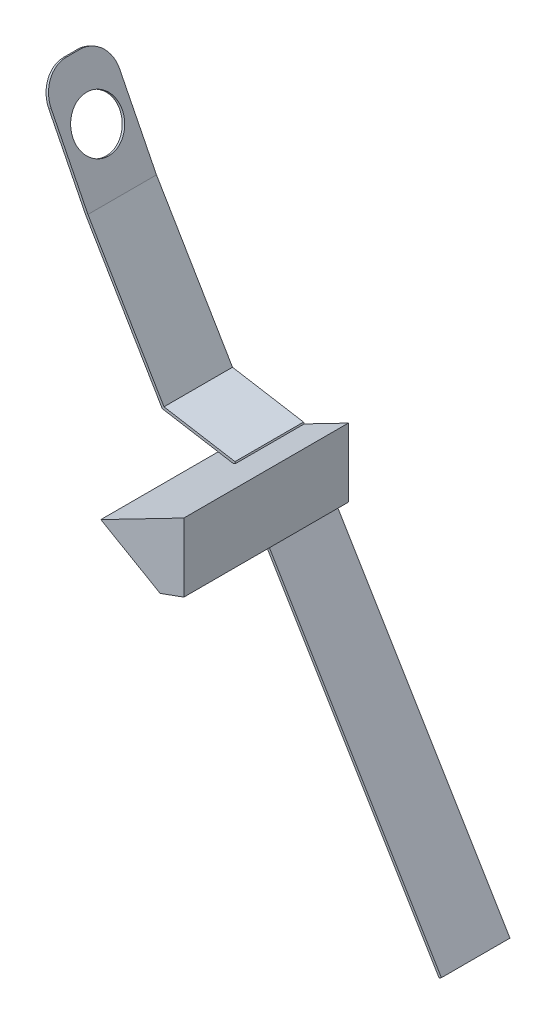
ISO-10303-21;
HEADER;
FILE_DESCRIPTION(('STEP AP214'),'2;1');
FILE_NAME('part.step','',(''),(''),'','','');
FILE_SCHEMA(('AUTOMOTIVE_DESIGN { 1 0 10303 214 1 1 1 1 }'));
ENDSEC;
DATA;
#1=APPLICATION_CONTEXT('core data for automotive mechanical design processes');
#2=APPLICATION_PROTOCOL_DEFINITION('international standard','automotive_design',2000,#1);
#3=PRODUCT_CONTEXT('',#1,'mechanical');
#4=PRODUCT('Part','Part','',(#3));
#5=PRODUCT_RELATED_PRODUCT_CATEGORY('part','',(#4));
#6=PRODUCT_DEFINITION_FORMATION('','',#4);
#7=PRODUCT_DEFINITION_CONTEXT('part definition',#1,'design');
#8=PRODUCT_DEFINITION('design','',#6,#7);
#9=PRODUCT_DEFINITION_SHAPE('','',#8);
#10=(LENGTH_UNIT() NAMED_UNIT(*) SI_UNIT(.MILLI.,.METRE.));
#11=(NAMED_UNIT(*) PLANE_ANGLE_UNIT() SI_UNIT($,.RADIAN.));
#12=(NAMED_UNIT(*) SI_UNIT($,.STERADIAN.) SOLID_ANGLE_UNIT());
#13=UNCERTAINTY_MEASURE_WITH_UNIT(LENGTH_MEASURE(1.E-05),#10,'distance_accuracy_value','');
#14=(GEOMETRIC_REPRESENTATION_CONTEXT(3) GLOBAL_UNCERTAINTY_ASSIGNED_CONTEXT((#13)) GLOBAL_UNIT_ASSIGNED_CONTEXT((#10,
#11,#12)) REPRESENTATION_CONTEXT('',''));
#15=CARTESIAN_POINT('',(0.,0.,0.));
#16=DIRECTION('',(0.,0.,1.));
#17=DIRECTION('',(1.,0.,0.));
#18=AXIS2_PLACEMENT_3D('',#15,#16,#17);
#19=CARTESIAN_POINT('',(40.9557511076707,157.673234146876,11.2182691909591));
#20=DIRECTION('',(-0.89375473782114,-0.448555981592339,0.));
#21=DIRECTION('',(0.448555981592339,-0.89375473782114,0.));
#22=AXIS2_PLACEMENT_3D('',#19,#20,#21);
#23=CYLINDRICAL_SURFACE('',#22,10.);
#24=DIRECTION('',(-0.89375473782114,-0.448555981592338,0.));
#25=VECTOR('',#24,1.);
#26=CARTESIAN_POINT('',(36.4701912917474,166.610781525088,11.218269190959));
#27=LINE('',#26,#25);
#28=CARTESIAN_POINT('',(-80.8799404831938,107.715313539515,11.218269190959));
#29=VERTEX_POINT('',#28);
#30=CARTESIAN_POINT('',(-81.7736952210149,107.266757557923,11.218269190959));
#31=VERTEX_POINT('',#30);
#32=EDGE_CURVE('E387',#29,#31,#27,.T.);
#33=ORIENTED_EDGE('',*,*,#32,.T.);
#34=CARTESIAN_POINT('',(-77.2881354050915,98.3292101797114,11.2182691909591));
#35=DIRECTION('',(-0.89375473782114,-0.448555981592338,0.));
#36=DIRECTION('',(0.448555981592338,-0.89375473782114,0.));
#37=AXIS2_PLACEMENT_3D('',#34,#35,#36);
#38=CIRCLE('',#37,10.);
#39=CARTESIAN_POINT('',(-77.2881354050915,98.3292101797114,21.2182691909591));
#40=VERTEX_POINT('',#39);
#41=EDGE_CURVE('E377',#40,#31,#38,.T.);
#42=ORIENTED_EDGE('',*,*,#41,.F.);
#43=DIRECTION('',(-0.89375473782114,-0.448555981592338,0.));
#44=VECTOR('',#43,1.);
#45=CARTESIAN_POINT('',(40.9557511076708,157.673234146876,21.2182691909591));
#46=LINE('',#45,#44);
#47=CARTESIAN_POINT('',(-76.3943806672704,98.7777661613037,21.2182691909591));
#48=VERTEX_POINT('',#47);
#49=EDGE_CURVE('E414',#48,#40,#46,.T.);
#50=ORIENTED_EDGE('',*,*,#49,.F.);
#51=CARTESIAN_POINT('',(-76.3943806672704,98.7777661613038,11.2182691909591));
#52=DIRECTION('',(0.89375473782114,0.448555981592338,0.));
#53=DIRECTION('',(0.448555981592338,-0.89375473782114,0.));
#54=AXIS2_PLACEMENT_3D('',#51,#52,#53);
#55=CIRCLE('',#54,10.);
#56=EDGE_CURVE('E361',#29,#48,#55,.T.);
#57=ORIENTED_EDGE('',*,*,#56,.F.);
#58=EDGE_LOOP('',(#33,#42,#50,#57));
#59=FACE_BOUND('',#58,.T.);
#60=ADVANCED_FACE('F14',(#59),#23,.T.);
#61=CARTESIAN_POINT('',(40.9557511076707,157.673234146876,6.21826919095909));
#62=DIRECTION('',(-0.89375473782114,-0.448555981592339,0.));
#63=DIRECTION('',(0.448555981592339,-0.89375473782114,0.));
#64=AXIS2_PLACEMENT_3D('',#61,#62,#63);
#65=CYLINDRICAL_SURFACE('',#64,10.);
#66=CARTESIAN_POINT('',(-76.3943806672704,98.7777661613038,6.21826919095909));
#67=DIRECTION('',(-0.89375473782114,-0.448555981592338,0.));
#68=DIRECTION('',(0.448555981592338,-0.89375473782114,0.));
#69=AXIS2_PLACEMENT_3D('',#66,#67,#68);
#70=CIRCLE('',#69,10.);
#71=CARTESIAN_POINT('',(-80.8799404831938,107.715313539515,6.21826919095909));
#72=VERTEX_POINT('',#71);
#73=CARTESIAN_POINT('',(-76.3943806672704,98.7777661613038,-3.78173080904092));
#74=VERTEX_POINT('',#73);
#75=EDGE_CURVE('E300',#72,#74,#70,.T.);
#76=ORIENTED_EDGE('',*,*,#75,.T.);
#77=DIRECTION('',(-0.89375473782114,-0.448555981592338,0.));
#78=VECTOR('',#77,1.);
#79=CARTESIAN_POINT('',(40.9557511076708,157.673234146876,-3.78173080904092));
#80=LINE('',#79,#78);
#81=CARTESIAN_POINT('',(-77.2881354050915,98.3292101797114,-3.78173080904092));
#82=VERTEX_POINT('',#81);
#83=EDGE_CURVE('E142',#74,#82,#80,.T.);
#84=ORIENTED_EDGE('',*,*,#83,.T.);
#85=CARTESIAN_POINT('',(-77.2881354050915,98.3292101797114,6.21826919095909));
#86=DIRECTION('',(0.89375473782114,0.448555981592338,0.));
#87=DIRECTION('',(0.448555981592338,-0.89375473782114,0.));
#88=AXIS2_PLACEMENT_3D('',#85,#86,#87);
#89=CIRCLE('',#88,10.);
#90=CARTESIAN_POINT('',(-81.7736952210149,107.266757557923,6.21826919095916));
#91=VERTEX_POINT('',#90);
#92=EDGE_CURVE('E388',#82,#91,#89,.T.);
#93=ORIENTED_EDGE('',*,*,#92,.T.);
#94=DIRECTION('',(-0.89375473782114,-0.448555981592338,0.));
#95=VECTOR('',#94,1.);
#96=CARTESIAN_POINT('',(36.4701912917474,166.610781525088,6.21826919095916));
#97=LINE('',#96,#95);
#98=EDGE_CURVE('E384',#72,#91,#97,.T.);
#99=ORIENTED_EDGE('',*,*,#98,.F.);
#100=EDGE_LOOP('',(#76,#84,#93,#99));
#101=FACE_BOUND('',#100,.T.);
#102=ADVANCED_FACE('F598',(#101),#65,.T.);
#103=CARTESIAN_POINT('',(45.4413109235942,148.735686768665,8.7182691909591));
#104=DIRECTION('',(-0.89375473782114,-0.448555981592338,0.));
#105=DIRECTION('',(0.448555981592338,-0.89375473782114,0.));
#106=AXIS2_PLACEMENT_3D('',#103,#104,#105);
#107=CYLINDRICAL_SURFACE('',#106,9.);
#108=DIRECTION('',(-0.89375473782114,-0.448555981592338,0.));
#109=VECTOR('',#108,1.);
#110=CARTESIAN_POINT('',(41.4043070892631,156.779479409056,8.7182691909591));
#111=LINE('',#110,#109);
#112=CARTESIAN_POINT('',(-75.945824685678,97.8840114234826,8.7182691909591));
#113=VERTEX_POINT('',#112);
#114=CARTESIAN_POINT('',(-76.8395794234992,97.4354554418902,8.7182691909591));
#115=VERTEX_POINT('',#114);
#116=EDGE_CURVE('E320',#113,#115,#111,.T.);
#117=ORIENTED_EDGE('',*,*,#116,.F.);
#118=CARTESIAN_POINT('',(-71.908820851347,89.8402187830923,8.7182691909591));
#119=DIRECTION('',(0.89375473782114,0.448555981592338,0.));
#120=DIRECTION('',(0.448555981592338,-0.89375473782114,0.));
#121=AXIS2_PLACEMENT_3D('',#118,#119,#120);
#122=CIRCLE('',#121,9.);
#123=CARTESIAN_POINT('',(-67.871817017016,81.7964261427021,8.71826919095909));
#124=VERTEX_POINT('',#123);
#125=EDGE_CURVE('E243',#113,#124,#122,.T.);
#126=ORIENTED_EDGE('',*,*,#125,.T.);
#127=DIRECTION('',(-0.89375473782114,-0.448555981592338,0.));
#128=VECTOR('',#127,1.);
#129=CARTESIAN_POINT('',(49.4783147579252,140.691894128275,8.7182691909591));
#130=LINE('',#129,#128);
#131=CARTESIAN_POINT('',(-68.7655717548371,81.3478701611097,8.71826919095909));
#132=VERTEX_POINT('',#131);
#133=EDGE_CURVE('E292',#124,#132,#130,.T.);
#134=ORIENTED_EDGE('',*,*,#133,.T.);
#135=CARTESIAN_POINT('',(-72.8025755891681,89.3916628015,8.7182691909591));
#136=DIRECTION('',(-0.89375473782114,-0.448555981592338,0.));
#137=DIRECTION('',(0.448555981592338,-0.89375473782114,0.));
#138=AXIS2_PLACEMENT_3D('',#135,#136,#137);
#139=CIRCLE('',#138,9.);
#140=EDGE_CURVE('E232',#132,#115,#139,.T.);
#141=ORIENTED_EDGE('',*,*,#140,.T.);
#142=EDGE_LOOP('',(#117,#126,#134,#141));
#143=FACE_BOUND('',#142,.T.);
#144=ADVANCED_FACE('F458',(#143),#107,.F.);
#145=CARTESIAN_POINT('',(34.4350596062457,-94.0127100872075,56.2182691909591));
#146=DIRECTION('',(0.,0.,-1.));
#147=DIRECTION('',(0.,-1.,0.));
#148=AXIS2_PLACEMENT_3D('',#145,#146,#147);
#149=PLANE('',#148);
#150=DIRECTION('',(-0.939910462979379,-0.341421032717507,0.));
#151=VECTOR('',#150,1.);
#152=CARTESIAN_POINT('',(7.04227570314696,3.56631866591899,56.2182691909591));
#153=LINE('',#152,#151);
#154=CARTESIAN_POINT('',(7.04227570314696,3.56631866591899,56.2182691909591));
#155=VERTEX_POINT('',#154);
#156=CARTESIAN_POINT('',(-1.60470092820694,0.425317679502938,56.2182691909591));
#157=VERTEX_POINT('',#156);
#158=EDGE_CURVE('E263',#155,#157,#153,.T.);
#159=ORIENTED_EDGE('',*,*,#158,.F.);
#160=DIRECTION('',(0.,-1.,0.));
#161=VECTOR('',#160,1.);
#162=CARTESIAN_POINT('',(7.04227570314696,3.56631866591899,56.2182691909591));
#163=LINE('',#162,#161);
#164=CARTESIAN_POINT('',(7.04227570314696,28.566318665919,56.2182691909591));
#165=VERTEX_POINT('',#164);
#166=EDGE_CURVE('E9',#165,#155,#163,.T.);
#167=ORIENTED_EDGE('',*,*,#166,.F.);
#168=DIRECTION('',(0.88857853117979,0.458724529457895,0.));
#169=VECTOR('',#168,1.);
#170=CARTESIAN_POINT('',(7.04227570314696,28.566318665919,56.2182691909591));
#171=LINE('',#170,#169);
#172=CARTESIAN_POINT('',(-23.2553360228179,12.9253176795029,56.2182691909591));
#173=VERTEX_POINT('',#172);
#174=EDGE_CURVE('E299',#173,#165,#171,.T.);
#175=ORIENTED_EDGE('',*,*,#174,.F.);
#176=DIRECTION('',(-0.866025403784439,0.5,0.));
#177=VECTOR('',#176,1.);
#178=CARTESIAN_POINT('',(-23.2553360228179,12.9253176795029,56.2182691909591));
#179=LINE('',#178,#177);
#180=EDGE_CURVE('E267',#157,#173,#179,.T.);
#181=ORIENTED_EDGE('',*,*,#180,.F.);
#182=EDGE_LOOP('',(#159,#167,#175,#181));
#183=FACE_BOUND('',#182,.T.);
#184=ADVANCED_FACE('F620',(#183),#149,.F.);
#185=CARTESIAN_POINT('',(7.04227570314697,3.56631866591899,-45.1321989178156));
#186=DIRECTION('',(-1.,0.,0.));
#187=DIRECTION('',(0.,0.,1.));
#188=AXIS2_PLACEMENT_3D('',#185,#186,#187);
#189=PLANE('',#188);
#190=DIRECTION('',(0.,-1.,0.));
#191=VECTOR('',#190,1.);
#192=CARTESIAN_POINT('',(7.04227570314697,3.56631866591899,-3.78173080904092));
#193=LINE('',#192,#191);
#194=CARTESIAN_POINT('',(7.04227570314697,28.566318665919,-3.78173080904092));
#195=VERTEX_POINT('',#194);
#196=CARTESIAN_POINT('',(7.04227570314697,3.56631866591899,-3.78173080904092));
#197=VERTEX_POINT('',#196);
#198=EDGE_CURVE('E362',#195,#197,#193,.T.);
#199=ORIENTED_EDGE('',*,*,#198,.F.);
#200=DIRECTION('',(0.,0.,1.));
#201=VECTOR('',#200,1.);
#202=CARTESIAN_POINT('',(7.04227570314697,28.566318665919,-45.1321989178156));
#203=LINE('',#202,#201);
#204=EDGE_CURVE('E25',#195,#165,#203,.T.);
#205=ORIENTED_EDGE('',*,*,#204,.T.);
#206=ORIENTED_EDGE('',*,*,#166,.T.);
#207=DIRECTION('',(0.,0.,1.));
#208=VECTOR('',#207,1.);
#209=CARTESIAN_POINT('',(7.04227570314697,3.56631866591899,-45.1321989178156));
#210=LINE('',#209,#208);
#211=EDGE_CURVE('E339',#197,#155,#210,.T.);
#212=ORIENTED_EDGE('',*,*,#211,.F.);
#213=EDGE_LOOP('',(#199,#205,#206,#212));
#214=FACE_BOUND('',#213,.T.);
#215=ADVANCED_FACE('F630',(#214),#189,.F.);
#216=CARTESIAN_POINT('',(7.04227570314697,28.566318665919,-45.1321989178156));
#217=DIRECTION('',(0.458724529457895,-0.88857853117979,0.));
#218=DIRECTION('',(0.,0.,-1.));
#219=AXIS2_PLACEMENT_3D('',#216,#217,#218);
#220=PLANE('',#219);
#221=DIRECTION('',(0.,0.,-1.));
#222=VECTOR('',#221,1.);
#223=CARTESIAN_POINT('',(-9.91871728987898,19.810285004455,21.2182691909591));
#224=LINE('',#223,#222);
#225=CARTESIAN_POINT('',(-9.91871728987898,19.810285004455,21.2182691909591));
#226=VERTEX_POINT('',#225);
#227=CARTESIAN_POINT('',(-9.91871728987898,19.810285004455,-3.78173080904092));
#228=VERTEX_POINT('',#227);
#229=EDGE_CURVE('E329',#226,#228,#224,.T.);
#230=ORIENTED_EDGE('',*,*,#229,.T.);
#231=DIRECTION('',(0.88857853117979,0.458724529457895,0.));
#232=VECTOR('',#231,1.);
#233=CARTESIAN_POINT('',(7.04227570314697,28.566318665919,-3.78173080904092));
#234=LINE('',#233,#232);
#235=CARTESIAN_POINT('',(-23.2553360228179,12.9253176795029,-3.78173080904092));
#236=VERTEX_POINT('',#235);
#237=EDGE_CURVE('E277',#236,#228,#234,.T.);
#238=ORIENTED_EDGE('',*,*,#237,.F.);
#239=DIRECTION('',(0.,0.,1.));
#240=VECTOR('',#239,1.);
#241=CARTESIAN_POINT('',(-23.2553360228179,12.9253176795029,-45.1321989178156));
#242=LINE('',#241,#240);
#243=EDGE_CURVE('E273',#236,#173,#242,.T.);
#244=ORIENTED_EDGE('',*,*,#243,.T.);
#245=ORIENTED_EDGE('',*,*,#174,.T.);
#246=ORIENTED_EDGE('',*,*,#204,.F.);
#247=DIRECTION('',(0.88857853117979,0.458724529457895,0.));
#248=VECTOR('',#247,1.);
#249=CARTESIAN_POINT('',(7.04227570314697,28.566318665919,-3.78173080904092));
#250=LINE('',#249,#248);
#251=CARTESIAN_POINT('',(-9.02830542147885,20.2699559857168,-3.78173080904092));
#252=VERTEX_POINT('',#251);
#253=EDGE_CURVE('E364',#252,#195,#250,.T.);
#254=ORIENTED_EDGE('',*,*,#253,.F.);
#255=DIRECTION('',(0.,0.,1.));
#256=VECTOR('',#255,1.);
#257=CARTESIAN_POINT('',(-9.02830542147884,20.2699559857168,21.2182691909591));
#258=LINE('',#257,#256);
#259=CARTESIAN_POINT('',(-9.02830542147886,20.2699559857168,21.2182691909591));
#260=VERTEX_POINT('',#259);
#261=EDGE_CURVE('E208',#252,#260,#258,.T.);
#262=ORIENTED_EDGE('',*,*,#261,.T.);
#263=DIRECTION('',(0.88857853117979,0.458724529457895,0.));
#264=VECTOR('',#263,1.);
#265=CARTESIAN_POINT('',(-31.4105545456091,8.7152240881952,21.2182691909591));
#266=LINE('',#265,#264);
#267=EDGE_CURVE('E383',#226,#260,#266,.T.);
#268=ORIENTED_EDGE('',*,*,#267,.F.);
#269=EDGE_LOOP('',(#230,#238,#244,#245,#246,#254,#262,#268));
#270=FACE_BOUND('',#269,.T.);
#271=ADVANCED_FACE('F640',(#270),#220,.F.);
#272=CARTESIAN_POINT('',(-23.2553360228179,12.9253176795029,-45.1321989178156));
#273=DIRECTION('',(0.5,0.866025403784439,0.));
#274=DIRECTION('',(0.,0.,-1.));
#275=AXIS2_PLACEMENT_3D('',#272,#273,#274);
#276=PLANE('',#275);
#277=DIRECTION('',(-0.866025403784439,0.5,0.));
#278=VECTOR('',#277,1.);
#279=CARTESIAN_POINT('',(-23.2553360228179,12.9253176795029,-3.78173080904092));
#280=LINE('',#279,#278);
#281=CARTESIAN_POINT('',(-1.60470092820693,0.425317679502938,-3.78173080904092));
#282=VERTEX_POINT('',#281);
#283=EDGE_CURVE('E270',#282,#236,#280,.T.);
#284=ORIENTED_EDGE('',*,*,#283,.F.);
#285=DIRECTION('',(0.,0.,1.));
#286=VECTOR('',#285,1.);
#287=CARTESIAN_POINT('',(-1.60470092820693,0.425317679502938,-45.1321989178156));
#288=LINE('',#287,#286);
#289=EDGE_CURVE('E256',#282,#157,#288,.T.);
#290=ORIENTED_EDGE('',*,*,#289,.T.);
#291=ORIENTED_EDGE('',*,*,#180,.T.);
#292=ORIENTED_EDGE('',*,*,#243,.F.);
#293=EDGE_LOOP('',(#284,#290,#291,#292));
#294=FACE_BOUND('',#293,.T.);
#295=ADVANCED_FACE('F271',(#294),#276,.F.);
#296=CARTESIAN_POINT('',(7.04227570314697,3.56631866591899,-45.1321989178156));
#297=DIRECTION('',(-0.341421032717507,0.93991046297938,0.));
#298=DIRECTION('',(0.,0.,1.));
#299=AXIS2_PLACEMENT_3D('',#296,#297,#298);
#300=PLANE('',#299);
#301=DIRECTION('',(0.,0.,-1.));
#302=VECTOR('',#301,1.);
#303=CARTESIAN_POINT('',(1.12531615134321,1.41699219250058,21.2182691909591));
#304=LINE('',#303,#302);
#305=CARTESIAN_POINT('',(1.12531615134321,1.41699219250058,21.2182691909591));
#306=VERTEX_POINT('',#305);
#307=CARTESIAN_POINT('',(1.12531615134321,1.41699219250058,-3.78173080904092));
#308=VERTEX_POINT('',#307);
#309=EDGE_CURVE('E181',#306,#308,#304,.T.);
#310=ORIENTED_EDGE('',*,*,#309,.F.);
#311=DIRECTION('',(-0.939910462979379,-0.341421032717507,0.));
#312=VECTOR('',#311,1.);
#313=CARTESIAN_POINT('',(-33.7642355829893,-11.256583912214,21.2182691909591));
#314=LINE('',#313,#312);
#315=CARTESIAN_POINT('',(2.08287954319903,1.7648256245315,21.2182691909591));
#316=VERTEX_POINT('',#315);
#317=EDGE_CURVE('E315',#316,#306,#314,.T.);
#318=ORIENTED_EDGE('',*,*,#317,.F.);
#319=DIRECTION('',(0.,0.,-1.));
#320=VECTOR('',#319,1.);
#321=CARTESIAN_POINT('',(2.08287954319905,1.76482562453148,21.2182691909591));
#322=LINE('',#321,#320);
#323=CARTESIAN_POINT('',(2.08287954319903,1.76482562453152,-3.78173080904092));
#324=VERTEX_POINT('',#323);
#325=EDGE_CURVE('E310',#316,#324,#322,.T.);
#326=ORIENTED_EDGE('',*,*,#325,.T.);
#327=DIRECTION('',(-0.939910462979379,-0.341421032717507,0.));
#328=VECTOR('',#327,1.);
#329=CARTESIAN_POINT('',(7.04227570314697,3.56631866591899,-3.78173080904092));
#330=LINE('',#329,#328);
#331=EDGE_CURVE('E96',#197,#324,#330,.T.);
#332=ORIENTED_EDGE('',*,*,#331,.F.);
#333=ORIENTED_EDGE('',*,*,#211,.T.);
#334=ORIENTED_EDGE('',*,*,#158,.T.);
#335=ORIENTED_EDGE('',*,*,#289,.F.);
#336=DIRECTION('',(-0.939910462979379,-0.341421032717507,0.));
#337=VECTOR('',#336,1.);
#338=CARTESIAN_POINT('',(7.04227570314697,3.56631866591899,-3.78173080904092));
#339=LINE('',#338,#337);
#340=EDGE_CURVE('E260',#308,#282,#339,.T.);
#341=ORIENTED_EDGE('',*,*,#340,.F.);
#342=EDGE_LOOP('',(#310,#318,#326,#332,#333,#334,#335,#341));
#343=FACE_BOUND('',#342,.T.);
#344=ADVANCED_FACE('F258',(#343),#300,.F.);
#345=CARTESIAN_POINT('',(-34.9741685060046,24.6842184807334,21.2182691909591));
#346=DIRECTION('',(-0.860750591998987,-0.509026932856596,0.));
#347=DIRECTION('',(-0.509026932856596,0.860750591998987,0.));
#348=AXIS2_PLACEMENT_3D('',#345,#346,#347);
#349=PLANE('',#348);
#350=DIRECTION('',(-0.509026932856596,0.860750591998987,0.));
#351=VECTOR('',#350,1.);
#352=CARTESIAN_POINT('',(-34.9741685060046,24.6842184807334,-3.78173080904092));
#353=LINE('',#352,#351);
#354=CARTESIAN_POINT('',(-35.2106707887185,25.0841373587243,-3.78173080904092));
#355=VERTEX_POINT('',#354);
#356=CARTESIAN_POINT('',(-62.9531611935689,71.9959282643511,-3.78173080904092));
#357=VERTEX_POINT('',#356);
#358=EDGE_CURVE('E155',#355,#357,#353,.T.);
#359=ORIENTED_EDGE('',*,*,#358,.T.);
#360=DIRECTION('',(0.,0.,-1.));
#361=VECTOR('',#360,1.);
#362=CARTESIAN_POINT('',(-62.9531611935688,71.9959282643511,21.2182691909591));
#363=LINE('',#362,#361);
#364=CARTESIAN_POINT('',(-62.9531611935689,71.9959282643511,21.2182691909591));
#365=VERTEX_POINT('',#364);
#366=EDGE_CURVE('E355',#365,#357,#363,.T.);
#367=ORIENTED_EDGE('',*,*,#366,.F.);
#368=DIRECTION('',(-0.509026932856596,0.860750591998987,0.));
#369=VECTOR('',#368,1.);
#370=CARTESIAN_POINT('',(-34.9741685060046,24.6842184807334,21.2182691909591));
#371=LINE('',#370,#369);
#372=CARTESIAN_POINT('',(-35.2106707887185,25.0841373587243,21.2182691909591));
#373=VERTEX_POINT('',#372);
#374=EDGE_CURVE('E373',#373,#365,#371,.T.);
#375=ORIENTED_EDGE('',*,*,#374,.F.);
#376=DIRECTION('',(0.,0.,-1.));
#377=VECTOR('',#376,1.);
#378=CARTESIAN_POINT('',(-35.2106707887185,25.0841373587243,21.2182691909591));
#379=LINE('',#378,#377);
#380=EDGE_CURVE('E328',#373,#355,#379,.T.);
#381=ORIENTED_EDGE('',*,*,#380,.T.);
#382=EDGE_LOOP('',(#359,#367,#375,#381));
#383=FACE_BOUND('',#382,.T.);
#384=ADVANCED_FACE('F487',(#383),#349,.F.);
#385=CARTESIAN_POINT('',(-9.7526325937587,20.7963964959785,21.2182691909591));
#386=DIRECTION('',(-0.166084696120281,-0.986111491523466,0.));
#387=DIRECTION('',(-0.986111491523466,0.166084696120281,0.));
#388=AXIS2_PLACEMENT_3D('',#385,#386,#387);
#389=PLANE('',#388);
#390=DIRECTION('',(-0.986111491523466,0.166084696120281,0.));
#391=VECTOR('',#390,1.);
#392=CARTESIAN_POINT('',(-9.7526325937587,20.7963964959785,-3.78173080904092));
#393=LINE('',#392,#391);
#394=CARTESIAN_POINT('',(-9.29847195079349,20.7199050109639,-3.78173080904092));
#395=VERTEX_POINT('',#394);
#396=EDGE_CURVE('E408',#395,#355,#393,.T.);
#397=ORIENTED_EDGE('',*,*,#396,.T.);
#398=ORIENTED_EDGE('',*,*,#380,.F.);
#399=DIRECTION('',(-0.986111491523466,0.166084696120281,0.));
#400=VECTOR('',#399,1.);
#401=CARTESIAN_POINT('',(-9.7526325937587,20.7963964959785,21.2182691909591));
#402=LINE('',#401,#400);
#403=CARTESIAN_POINT('',(-9.29847195079348,20.7199050109638,21.2182691909591));
#404=VERTEX_POINT('',#403);
#405=EDGE_CURVE('E378',#404,#373,#402,.T.);
#406=ORIENTED_EDGE('',*,*,#405,.F.);
#407=DIRECTION('',(0.,0.,-1.));
#408=VECTOR('',#407,1.);
#409=CARTESIAN_POINT('',(-9.29847195079348,20.7199050109638,21.2182691909591));
#410=LINE('',#409,#408);
#411=EDGE_CURVE('E220',#404,#395,#410,.T.);
#412=ORIENTED_EDGE('',*,*,#411,.T.);
#413=EDGE_LOOP('',(#397,#398,#406,#412));
#414=FACE_BOUND('',#413,.T.);
#415=ADVANCED_FACE('F775',(#414),#389,.F.);
#416=CARTESIAN_POINT('',(-35.8349190980036,24.1751915478768,21.2182691909591));
#417=DIRECTION('',(-0.860750591998987,-0.509026932856596,0.));
#418=DIRECTION('',(-0.509026932856596,0.860750591998987,0.));
#419=AXIS2_PLACEMENT_3D('',#416,#417,#418);
#420=PLANE('',#419);
#421=DIRECTION('',(-0.509026932856596,0.860750591998987,0.));
#422=VECTOR('',#421,1.);
#423=CARTESIAN_POINT('',(-35.8349190980036,24.1751915478768,-3.78173080904092));
#424=LINE('',#423,#422);
#425=CARTESIAN_POINT('',(-35.8349190980036,24.1751915478768,-3.78173080904092));
#426=VERTEX_POINT('',#425);
#427=CARTESIAN_POINT('',(-63.8314559573214,71.5165680450772,-3.78173080904092));
#428=VERTEX_POINT('',#427);
#429=EDGE_CURVE('E342',#426,#428,#424,.T.);
#430=ORIENTED_EDGE('',*,*,#429,.F.);
#431=DIRECTION('',(0.,0.,-1.));
#432=VECTOR('',#431,1.);
#433=CARTESIAN_POINT('',(-35.8349190980036,24.1751915478768,21.2182691909591));
#434=LINE('',#433,#432);
#435=CARTESIAN_POINT('',(-35.8349190980036,24.1751915478768,21.2182691909591));
#436=VERTEX_POINT('',#435);
#437=EDGE_CURVE('E326',#436,#426,#434,.T.);
#438=ORIENTED_EDGE('',*,*,#437,.F.);
#439=DIRECTION('',(-0.509026932856596,0.860750591998987,0.));
#440=VECTOR('',#439,1.);
#441=CARTESIAN_POINT('',(-35.8349190980036,24.1751915478768,21.2182691909591));
#442=LINE('',#441,#440);
#443=CARTESIAN_POINT('',(-63.8314559573214,71.5165680450772,21.2182691909591));
#444=VERTEX_POINT('',#443);
#445=EDGE_CURVE('E413',#436,#444,#442,.T.);
#446=ORIENTED_EDGE('',*,*,#445,.T.);
#447=DIRECTION('',(0.,0.,-1.));
#448=VECTOR('',#447,1.);
#449=CARTESIAN_POINT('',(-63.8314559573214,71.5165680450772,21.2182691909591));
#450=LINE('',#449,#448);
#451=EDGE_CURVE('E372',#444,#428,#450,.T.);
#452=ORIENTED_EDGE('',*,*,#451,.T.);
#453=EDGE_LOOP('',(#430,#438,#446,#452));
#454=FACE_BOUND('',#453,.T.);
#455=ADVANCED_FACE('F767',(#454),#420,.T.);
#456=CARTESIAN_POINT('',(-9.91871728987898,19.810285004455,21.2182691909591));
#457=DIRECTION('',(-0.166084696120281,-0.986111491523466,0.));
#458=DIRECTION('',(-0.986111491523466,0.166084696120281,0.));
#459=AXIS2_PLACEMENT_3D('',#456,#457,#458);
#460=PLANE('',#459);
#461=DIRECTION('',(-0.986111491523466,0.166084696120281,0.));
#462=VECTOR('',#461,1.);
#463=CARTESIAN_POINT('',(-9.91871728987898,19.810285004455,-3.78173080904092));
#464=LINE('',#463,#462);
#465=EDGE_CURVE('E18',#228,#426,#464,.T.);
#466=ORIENTED_EDGE('',*,*,#465,.F.);
#467=ORIENTED_EDGE('',*,*,#229,.F.);
#468=DIRECTION('',(-0.986111491523466,0.166084696120281,0.));
#469=VECTOR('',#468,1.);
#470=CARTESIAN_POINT('',(-9.91871728987898,19.810285004455,21.2182691909591));
#471=LINE('',#470,#469);
#472=EDGE_CURVE('E436',#226,#436,#471,.T.);
#473=ORIENTED_EDGE('',*,*,#472,.T.);
#474=ORIENTED_EDGE('',*,*,#437,.T.);
#475=EDGE_LOOP('',(#466,#467,#473,#474));
#476=FACE_BOUND('',#475,.T.);
#477=ADVANCED_FACE('F759',(#476),#460,.T.);
#478=CARTESIAN_POINT('',(65.1561943172899,-105.223276272904,21.2182691909591));
#479=DIRECTION('',(-0.514771889658136,0.85732718469543,0.));
#480=DIRECTION('',(0.,0.,1.));
#481=AXIS2_PLACEMENT_3D('',#478,#479,#480);
#482=PLANE('',#481);
#483=DIRECTION('',(0.,0.,-1.));
#484=VECTOR('',#483,1.);
#485=CARTESIAN_POINT('',(66.0135215019853,-104.708504383246,21.2182691909591));
#486=LINE('',#485,#484);
#487=CARTESIAN_POINT('',(66.0135215019853,-104.708504383246,21.2182691909591));
#488=VERTEX_POINT('',#487);
#489=CARTESIAN_POINT('',(66.0135215019853,-104.708504383246,-3.78173080904092));
#490=VERTEX_POINT('',#489);
#491=EDGE_CURVE('E305',#488,#490,#486,.T.);
#492=ORIENTED_EDGE('',*,*,#491,.F.);
#493=DIRECTION('',(-0.85732718469543,-0.514771889658136,0.));
#494=VECTOR('',#493,1.);
#495=CARTESIAN_POINT('',(65.1561943172899,-105.223276272904,21.2182691909591));
#496=LINE('',#495,#494);
#497=CARTESIAN_POINT('',(65.1561943172899,-105.223276272904,21.2182691909591));
#498=VERTEX_POINT('',#497);
#499=EDGE_CURVE('E314',#488,#498,#496,.T.);
#500=ORIENTED_EDGE('',*,*,#499,.T.);
#501=DIRECTION('',(0.,0.,-1.));
#502=VECTOR('',#501,1.);
#503=CARTESIAN_POINT('',(65.1561943172899,-105.223276272904,21.2182691909591));
#504=LINE('',#503,#502);
#505=CARTESIAN_POINT('',(65.1561943172899,-105.223276272904,-3.78173080904092));
#506=VERTEX_POINT('',#505);
#507=EDGE_CURVE('E192',#498,#506,#504,.T.);
#508=ORIENTED_EDGE('',*,*,#507,.T.);
#509=DIRECTION('',(-0.85732718469543,-0.514771889658136,0.));
#510=VECTOR('',#509,1.);
#511=CARTESIAN_POINT('',(65.1561943172899,-105.223276272904,-3.78173080904092));
#512=LINE('',#511,#510);
#513=EDGE_CURVE('E109',#490,#506,#512,.T.);
#514=ORIENTED_EDGE('',*,*,#513,.F.);
#515=EDGE_LOOP('',(#492,#500,#508,#514));
#516=FACE_BOUND('',#515,.T.);
#517=ADVANCED_FACE('F751',(#516),#482,.F.);
#518=CARTESIAN_POINT('',(65.1561943172899,-105.223276272904,-3.78173080904092));
#519=DIRECTION('',(0.,0.,1.));
#520=DIRECTION('',(1.,0.,0.));
#521=AXIS2_PLACEMENT_3D('',#518,#519,#520);
#522=PLANE('',#521);
#523=ORIENTED_EDGE('',*,*,#83,.F.);
#524=DIRECTION('',(-0.448555981592338,0.89375473782114,0.));
#525=VECTOR('',#524,1.);
#526=CARTESIAN_POINT('',(-62.9377012195002,71.9651240266696,-3.78173080904092));
#527=LINE('',#526,#525);
#528=EDGE_CURVE('E304',#357,#74,#527,.T.);
#529=ORIENTED_EDGE('',*,*,#528,.F.);
#530=ORIENTED_EDGE('',*,*,#358,.F.);
#531=ORIENTED_EDGE('',*,*,#396,.F.);
#532=DIRECTION('',(-0.514771889658136,0.85732718469543,0.));
#533=VECTOR('',#532,1.);
#534=CARTESIAN_POINT('',(66.0135215019853,-104.708504383246,-3.78173080904092));
#535=LINE('',#534,#533);
#536=EDGE_CURVE('E395',#252,#395,#535,.T.);
#537=ORIENTED_EDGE('',*,*,#536,.F.);
#538=ORIENTED_EDGE('',*,*,#253,.T.);
#539=ORIENTED_EDGE('',*,*,#198,.T.);
#540=ORIENTED_EDGE('',*,*,#331,.T.);
#541=DIRECTION('',(-0.514771889658136,0.85732718469543,0.));
#542=VECTOR('',#541,1.);
#543=CARTESIAN_POINT('',(66.0135215019853,-104.708504383246,-3.78173080904092));
#544=LINE('',#543,#542);
#545=EDGE_CURVE('E309',#490,#324,#544,.T.);
#546=ORIENTED_EDGE('',*,*,#545,.F.);
#547=ORIENTED_EDGE('',*,*,#513,.T.);
#548=DIRECTION('',(-0.514771889658136,0.85732718469543,0.));
#549=VECTOR('',#548,1.);
#550=CARTESIAN_POINT('',(65.1561943172899,-105.223276272904,-3.78173080904092));
#551=LINE('',#550,#549);
#552=EDGE_CURVE('E280',#506,#308,#551,.T.);
#553=ORIENTED_EDGE('',*,*,#552,.T.);
#554=ORIENTED_EDGE('',*,*,#340,.T.);
#555=ORIENTED_EDGE('',*,*,#283,.T.);
#556=ORIENTED_EDGE('',*,*,#237,.T.);
#557=ORIENTED_EDGE('',*,*,#465,.T.);
#558=ORIENTED_EDGE('',*,*,#429,.T.);
#559=DIRECTION('',(-0.448555981592338,0.89375473782114,0.));
#560=VECTOR('',#559,1.);
#561=CARTESIAN_POINT('',(-63.8314559573214,71.5165680450772,-3.78173080904092));
#562=LINE('',#561,#560);
#563=EDGE_CURVE('E350',#428,#82,#562,.T.);
#564=ORIENTED_EDGE('',*,*,#563,.T.);
#565=EDGE_LOOP('',(#523,#529,#530,#531,#537,#538,#539,#540,#546,#547,#553,#554,#555,#556,#557,
#558,#564));
#566=FACE_BOUND('',#565,.T.);
#567=ADVANCED_FACE('F279',(#566),#522,.F.);
#568=CARTESIAN_POINT('',(-81.7736952210149,107.266757557923,21.2182691909591));
#569=DIRECTION('',(-0.448555981592338,0.89375473782114,0.));
#570=DIRECTION('',(0.,0.,1.));
#571=AXIS2_PLACEMENT_3D('',#568,#569,#570);
#572=PLANE('',#571);
#573=ORIENTED_EDGE('',*,*,#32,.F.);
#574=DIRECTION('',(0.,0.,-1.));
#575=VECTOR('',#574,1.);
#576=CARTESIAN_POINT('',(-80.8799404831938,107.715313539515,21.2182691909591));
#577=LINE('',#576,#575);
#578=EDGE_CURVE('E303',#29,#72,#577,.T.);
#579=ORIENTED_EDGE('',*,*,#578,.T.);
#580=ORIENTED_EDGE('',*,*,#98,.T.);
#581=DIRECTION('',(0.,0.,-1.));
#582=VECTOR('',#581,1.);
#583=CARTESIAN_POINT('',(-81.7736952210149,107.266757557923,21.2182691909591));
#584=LINE('',#583,#582);
#585=EDGE_CURVE('E391',#31,#91,#584,.T.);
#586=ORIENTED_EDGE('',*,*,#585,.F.);
#587=EDGE_LOOP('',(#573,#579,#580,#586));
#588=FACE_BOUND('',#587,.T.);
#589=ADVANCED_FACE('F736',(#588),#572,.T.);
#590=CARTESIAN_POINT('',(66.0135215019853,-104.708504383246,21.2182691909591));
#591=DIRECTION('',(-0.85732718469543,-0.514771889658136,0.));
#592=DIRECTION('',(-0.514771889658136,0.85732718469543,0.));
#593=AXIS2_PLACEMENT_3D('',#590,#591,#592);
#594=PLANE('',#593);
#595=ORIENTED_EDGE('',*,*,#261,.F.);
#596=ORIENTED_EDGE('',*,*,#536,.T.);
#597=ORIENTED_EDGE('',*,*,#411,.F.);
#598=DIRECTION('',(-0.514771889658136,0.85732718469543,0.));
#599=VECTOR('',#598,1.);
#600=CARTESIAN_POINT('',(66.0135215019853,-104.708504383246,21.2182691909591));
#601=LINE('',#600,#599);
#602=EDGE_CURVE('E379',#260,#404,#601,.T.);
#603=ORIENTED_EDGE('',*,*,#602,.F.);
#604=EDGE_LOOP('',(#595,#596,#597,#603));
#605=FACE_BOUND('',#604,.T.);
#606=ADVANCED_FACE('F16',(#605),#594,.F.);
#607=CARTESIAN_POINT('',(66.0135215019853,-104.708504383246,21.2182691909591));
#608=DIRECTION('',(-0.85732718469543,-0.514771889658136,0.));
#609=DIRECTION('',(-0.514771889658136,0.85732718469543,0.));
#610=AXIS2_PLACEMENT_3D('',#607,#608,#609);
#611=PLANE('',#610);
#612=ORIENTED_EDGE('',*,*,#325,.F.);
#613=DIRECTION('',(-0.514771889658136,0.85732718469543,0.));
#614=VECTOR('',#613,1.);
#615=CARTESIAN_POINT('',(66.0135215019853,-104.708504383246,21.2182691909591));
#616=LINE('',#615,#614);
#617=EDGE_CURVE('E290',#488,#316,#616,.T.);
#618=ORIENTED_EDGE('',*,*,#617,.F.);
#619=ORIENTED_EDGE('',*,*,#491,.T.);
#620=ORIENTED_EDGE('',*,*,#545,.T.);
#621=EDGE_LOOP('',(#612,#618,#619,#620));
#622=FACE_BOUND('',#621,.T.);
#623=ADVANCED_FACE('F720',(#622),#611,.F.);
#624=CARTESIAN_POINT('',(65.1561943172899,-105.223276272904,21.2182691909591));
#625=DIRECTION('',(-0.85732718469543,-0.514771889658136,0.));
#626=DIRECTION('',(-0.514771889658136,0.85732718469543,0.));
#627=AXIS2_PLACEMENT_3D('',#624,#625,#626);
#628=PLANE('',#627);
#629=DIRECTION('',(-0.514771889658136,0.85732718469543,0.));
#630=VECTOR('',#629,1.);
#631=CARTESIAN_POINT('',(65.1561943172899,-105.223276272904,21.2182691909591));
#632=LINE('',#631,#630);
#633=EDGE_CURVE('E311',#498,#306,#632,.T.);
#634=ORIENTED_EDGE('',*,*,#633,.T.);
#635=ORIENTED_EDGE('',*,*,#309,.T.);
#636=ORIENTED_EDGE('',*,*,#552,.F.);
#637=ORIENTED_EDGE('',*,*,#507,.F.);
#638=EDGE_LOOP('',(#634,#635,#636,#637));
#639=FACE_BOUND('',#638,.T.);
#640=ADVANCED_FACE('F711',(#639),#628,.T.);
#641=CARTESIAN_POINT('',(-63.8314559573214,71.5165680450772,21.2182691909591));
#642=DIRECTION('',(0.,0.,1.));
#643=DIRECTION('',(1.,0.,0.));
#644=AXIS2_PLACEMENT_3D('',#641,#642,#643);
#645=PLANE('',#644);
#646=ORIENTED_EDGE('',*,*,#617,.T.);
#647=ORIENTED_EDGE('',*,*,#317,.T.);
#648=ORIENTED_EDGE('',*,*,#633,.F.);
#649=ORIENTED_EDGE('',*,*,#499,.F.);
#650=EDGE_LOOP('',(#646,#647,#648,#649));
#651=FACE_BOUND('',#650,.T.);
#652=ADVANCED_FACE('F703',(#651),#645,.T.);
#653=CARTESIAN_POINT('',(-62.9377012195002,71.9651240266696,21.2182691909591));
#654=DIRECTION('',(-0.89375473782114,-0.448555981592338,0.));
#655=DIRECTION('',(-0.448555981592338,0.89375473782114,0.));
#656=AXIS2_PLACEMENT_3D('',#653,#654,#655);
#657=PLANE('',#656);
#658=CARTESIAN_POINT('',(-71.908820851347,89.8402187830923,8.7182691909591));
#659=DIRECTION('',(0.89375473782114,0.448555981592338,0.));
#660=DIRECTION('',(0.448555981592338,-0.89375473782114,0.));
#661=AXIS2_PLACEMENT_3D('',#658,#659,#660);
#662=CIRCLE('',#661,9.);
#663=EDGE_CURVE('E323',#124,#113,#662,.T.);
#664=ORIENTED_EDGE('',*,*,#663,.F.);
#665=ORIENTED_EDGE('',*,*,#125,.F.);
#666=EDGE_LOOP('',(#664,#665));
#667=FACE_BOUND('',#666,.T.);
#668=ORIENTED_EDGE('',*,*,#56,.T.);
#669=DIRECTION('',(-0.448555981592338,0.89375473782114,0.));
#670=VECTOR('',#669,1.);
#671=CARTESIAN_POINT('',(-62.9377012195002,71.9651240266696,21.2182691909591));
#672=LINE('',#671,#670);
#673=EDGE_CURVE('E295',#365,#48,#672,.T.);
#674=ORIENTED_EDGE('',*,*,#673,.F.);
#675=ORIENTED_EDGE('',*,*,#366,.T.);
#676=ORIENTED_EDGE('',*,*,#528,.T.);
#677=ORIENTED_EDGE('',*,*,#75,.F.);
#678=ORIENTED_EDGE('',*,*,#578,.F.);
#679=EDGE_LOOP('',(#668,#674,#675,#676,#677,#678));
#680=FACE_BOUND('',#679,.T.);
#681=ADVANCED_FACE('F479',(#667,#680),#657,.F.);
#682=CARTESIAN_POINT('',(-63.8314559573214,71.5165680450772,21.2182691909591));
#683=DIRECTION('',(-0.89375473782114,-0.448555981592338,0.));
#684=DIRECTION('',(-0.448555981592338,0.89375473782114,0.));
#685=AXIS2_PLACEMENT_3D('',#682,#683,#684);
#686=PLANE('',#685);
#687=ORIENTED_EDGE('',*,*,#140,.F.);
#688=CARTESIAN_POINT('',(-72.8025755891681,89.3916628015,8.7182691909591));
#689=DIRECTION('',(-0.89375473782114,-0.448555981592338,0.));
#690=DIRECTION('',(0.448555981592338,-0.89375473782114,0.));
#691=AXIS2_PLACEMENT_3D('',#688,#689,#690);
#692=CIRCLE('',#691,9.);
#693=EDGE_CURVE('E296',#115,#132,#692,.T.);
#694=ORIENTED_EDGE('',*,*,#693,.F.);
#695=EDGE_LOOP('',(#687,#694));
#696=FACE_BOUND('',#695,.T.);
#697=DIRECTION('',(-0.448555981592338,0.89375473782114,0.));
#698=VECTOR('',#697,1.);
#699=CARTESIAN_POINT('',(-63.8314559573214,71.5165680450772,21.2182691909591));
#700=LINE('',#699,#698);
#701=EDGE_CURVE('E409',#444,#40,#700,.T.);
#702=ORIENTED_EDGE('',*,*,#701,.T.);
#703=ORIENTED_EDGE('',*,*,#41,.T.);
#704=ORIENTED_EDGE('',*,*,#585,.T.);
#705=ORIENTED_EDGE('',*,*,#92,.F.);
#706=ORIENTED_EDGE('',*,*,#563,.F.);
#707=ORIENTED_EDGE('',*,*,#451,.F.);
#708=EDGE_LOOP('',(#702,#703,#704,#705,#706,#707));
#709=FACE_BOUND('',#708,.T.);
#710=ADVANCED_FACE('F456',(#696,#709),#686,.T.);
#711=CARTESIAN_POINT('',(-63.8314559573214,71.5165680450772,21.2182691909591));
#712=DIRECTION('',(0.,0.,1.));
#713=DIRECTION('',(1.,0.,0.));
#714=AXIS2_PLACEMENT_3D('',#711,#712,#713);
#715=PLANE('',#714);
#716=ORIENTED_EDGE('',*,*,#673,.T.);
#717=ORIENTED_EDGE('',*,*,#49,.T.);
#718=ORIENTED_EDGE('',*,*,#701,.F.);
#719=ORIENTED_EDGE('',*,*,#445,.F.);
#720=ORIENTED_EDGE('',*,*,#472,.F.);
#721=ORIENTED_EDGE('',*,*,#267,.T.);
#722=ORIENTED_EDGE('',*,*,#602,.T.);
#723=ORIENTED_EDGE('',*,*,#405,.T.);
#724=ORIENTED_EDGE('',*,*,#374,.T.);
#725=EDGE_LOOP('',(#716,#717,#718,#719,#720,#721,#722,#723,#724));
#726=FACE_BOUND('',#725,.T.);
#727=ADVANCED_FACE('F484',(#726),#715,.T.);
#728=CARTESIAN_POINT('',(45.4413109235942,148.735686768665,8.7182691909591));
#729=DIRECTION('',(-0.89375473782114,-0.448555981592338,0.));
#730=DIRECTION('',(0.448555981592338,-0.89375473782114,0.));
#731=AXIS2_PLACEMENT_3D('',#728,#729,#730);
#732=CYLINDRICAL_SURFACE('',#731,9.);
#733=ORIENTED_EDGE('',*,*,#663,.T.);
#734=ORIENTED_EDGE('',*,*,#116,.T.);
#735=ORIENTED_EDGE('',*,*,#693,.T.);
#736=ORIENTED_EDGE('',*,*,#133,.F.);
#737=EDGE_LOOP('',(#733,#734,#735,#736));
#738=FACE_BOUND('',#737,.T.);
#739=ADVANCED_FACE('F454',(#738),#732,.F.);
#740=CLOSED_SHELL('',(#60,#102,#144,#184,#215,#271,#295,#344,#384,#415,#455,#477,#517,#567,#589,
#606,#623,#640,#652,#681,#710,#727,#739));
#741=MANIFOLD_SOLID_BREP('B1',#740);
#742=ADVANCED_BREP_SHAPE_REPRESENTATION('',(#18,#741),#14);
#743=SHAPE_DEFINITION_REPRESENTATION(#9,#742);
ENDSEC;
END-ISO-10303-21;
